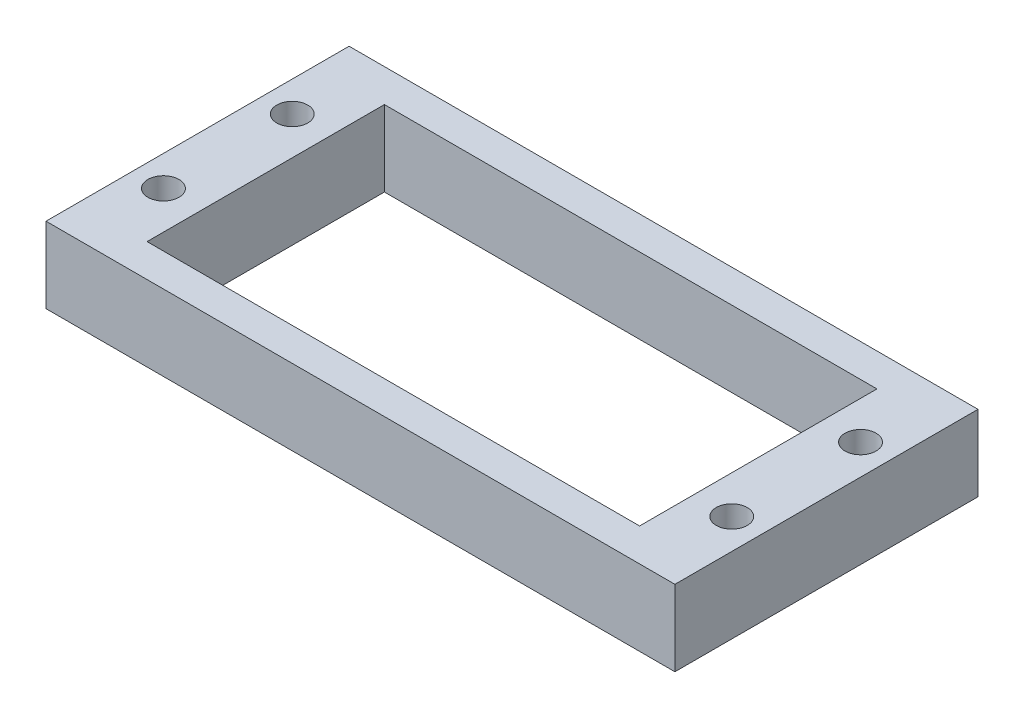
ISO-10303-21;
HEADER;
FILE_DESCRIPTION(('STEP AP214'),'2;1');
FILE_NAME('part.step','',(''),(''),'','','');
FILE_SCHEMA(('AUTOMOTIVE_DESIGN { 1 0 10303 214 1 1 1 1 }'));
ENDSEC;
DATA;
#1=APPLICATION_CONTEXT('core data for automotive mechanical design processes');
#2=APPLICATION_PROTOCOL_DEFINITION('international standard','automotive_design',2000,#1);
#3=PRODUCT_CONTEXT('',#1,'mechanical');
#4=PRODUCT('Part','Part','',(#3));
#5=PRODUCT_RELATED_PRODUCT_CATEGORY('part','',(#4));
#6=PRODUCT_DEFINITION_FORMATION('','',#4);
#7=PRODUCT_DEFINITION_CONTEXT('part definition',#1,'design');
#8=PRODUCT_DEFINITION('design','',#6,#7);
#9=PRODUCT_DEFINITION_SHAPE('','',#8);
#10=(LENGTH_UNIT() NAMED_UNIT(*) SI_UNIT(.MILLI.,.METRE.));
#11=(NAMED_UNIT(*) PLANE_ANGLE_UNIT() SI_UNIT($,.RADIAN.));
#12=(NAMED_UNIT(*) SI_UNIT($,.STERADIAN.) SOLID_ANGLE_UNIT());
#13=UNCERTAINTY_MEASURE_WITH_UNIT(LENGTH_MEASURE(1.E-05),#10,'distance_accuracy_value','');
#14=(GEOMETRIC_REPRESENTATION_CONTEXT(3) GLOBAL_UNCERTAINTY_ASSIGNED_CONTEXT((#13)) GLOBAL_UNIT_ASSIGNED_CONTEXT((#10,
#11,#12)) REPRESENTATION_CONTEXT('',''));
#15=CARTESIAN_POINT('',(0.,0.,0.));
#16=DIRECTION('',(0.,0.,1.));
#17=DIRECTION('',(1.,0.,0.));
#18=AXIS2_PLACEMENT_3D('',#15,#16,#17);
#19=CARTESIAN_POINT('',(41.5,10.,0.));
#20=DIRECTION('',(1.,0.,0.));
#21=DIRECTION('',(0.,0.,-1.));
#22=AXIS2_PLACEMENT_3D('',#19,#20,#21);
#23=PLANE('',#22);
#24=DIRECTION('',(0.,0.,1.));
#25=VECTOR('',#24,1.);
#26=CARTESIAN_POINT('',(41.5,0.,0.));
#27=LINE('',#26,#25);
#28=CARTESIAN_POINT('',(41.5,0.,-20.));
#29=VERTEX_POINT('',#28);
#30=CARTESIAN_POINT('',(41.5,0.,20.));
#31=VERTEX_POINT('',#30);
#32=EDGE_CURVE('E161',#29,#31,#27,.T.);
#33=ORIENTED_EDGE('',*,*,#32,.F.);
#34=DIRECTION('',(0.,-1.,0.));
#35=VECTOR('',#34,1.);
#36=CARTESIAN_POINT('',(41.5,10.,-20.));
#37=LINE('',#36,#35);
#38=CARTESIAN_POINT('',(41.5,10.,-20.));
#39=VERTEX_POINT('',#38);
#40=EDGE_CURVE('E11',#39,#29,#37,.T.);
#41=ORIENTED_EDGE('',*,*,#40,.F.);
#42=DIRECTION('',(0.,0.,1.));
#43=VECTOR('',#42,1.);
#44=CARTESIAN_POINT('',(41.5,10.,0.));
#45=LINE('',#44,#43);
#46=CARTESIAN_POINT('',(41.5,10.,20.));
#47=VERTEX_POINT('',#46);
#48=EDGE_CURVE('E129',#39,#47,#45,.T.);
#49=ORIENTED_EDGE('',*,*,#48,.T.);
#50=DIRECTION('',(0.,-1.,0.));
#51=VECTOR('',#50,1.);
#52=CARTESIAN_POINT('',(41.5,10.,20.));
#53=LINE('',#52,#51);
#54=EDGE_CURVE('E89',#47,#31,#53,.T.);
#55=ORIENTED_EDGE('',*,*,#54,.T.);
#56=EDGE_LOOP('',(#33,#41,#49,#55));
#57=FACE_BOUND('',#56,.T.);
#58=ADVANCED_FACE('F35',(#57),#23,.T.);
#59=CARTESIAN_POINT('',(0.,10.,-20.));
#60=DIRECTION('',(0.,0.,-1.));
#61=DIRECTION('',(-1.,0.,0.));
#62=AXIS2_PLACEMENT_3D('',#59,#60,#61);
#63=PLANE('',#62);
#64=DIRECTION('',(1.,0.,0.));
#65=VECTOR('',#64,1.);
#66=CARTESIAN_POINT('',(0.,0.,-20.));
#67=LINE('',#66,#65);
#68=CARTESIAN_POINT('',(-41.5,0.,-20.));
#69=VERTEX_POINT('',#68);
#70=EDGE_CURVE('E118',#69,#29,#67,.T.);
#71=ORIENTED_EDGE('',*,*,#70,.F.);
#72=DIRECTION('',(0.,-1.,0.));
#73=VECTOR('',#72,1.);
#74=CARTESIAN_POINT('',(-41.5,10.,-20.));
#75=LINE('',#74,#73);
#76=CARTESIAN_POINT('',(-41.5,10.,-20.));
#77=VERTEX_POINT('',#76);
#78=EDGE_CURVE('E45',#77,#69,#75,.T.);
#79=ORIENTED_EDGE('',*,*,#78,.F.);
#80=DIRECTION('',(1.,0.,0.));
#81=VECTOR('',#80,1.);
#82=CARTESIAN_POINT('',(0.,10.,-20.));
#83=LINE('',#82,#81);
#84=EDGE_CURVE('E116',#77,#39,#83,.T.);
#85=ORIENTED_EDGE('',*,*,#84,.T.);
#86=ORIENTED_EDGE('',*,*,#40,.T.);
#87=EDGE_LOOP('',(#71,#79,#85,#86));
#88=FACE_BOUND('',#87,.T.);
#89=ADVANCED_FACE('F114',(#88),#63,.T.);
#90=CARTESIAN_POINT('',(-41.5,10.,0.));
#91=DIRECTION('',(1.,0.,0.));
#92=DIRECTION('',(0.,0.,-1.));
#93=AXIS2_PLACEMENT_3D('',#90,#91,#92);
#94=PLANE('',#93);
#95=DIRECTION('',(0.,0.,1.));
#96=VECTOR('',#95,1.);
#97=CARTESIAN_POINT('',(-41.5,0.,0.));
#98=LINE('',#97,#96);
#99=CARTESIAN_POINT('',(-41.5,0.,20.));
#100=VERTEX_POINT('',#99);
#101=EDGE_CURVE('E164',#69,#100,#98,.T.);
#102=ORIENTED_EDGE('',*,*,#101,.T.);
#103=DIRECTION('',(0.,-1.,0.));
#104=VECTOR('',#103,1.);
#105=CARTESIAN_POINT('',(-41.5,10.,20.));
#106=LINE('',#105,#104);
#107=CARTESIAN_POINT('',(-41.5,10.,20.));
#108=VERTEX_POINT('',#107);
#109=EDGE_CURVE('E121',#108,#100,#106,.T.);
#110=ORIENTED_EDGE('',*,*,#109,.F.);
#111=DIRECTION('',(0.,0.,1.));
#112=VECTOR('',#111,1.);
#113=CARTESIAN_POINT('',(-41.5,10.,0.));
#114=LINE('',#113,#112);
#115=EDGE_CURVE('E124',#77,#108,#114,.T.);
#116=ORIENTED_EDGE('',*,*,#115,.F.);
#117=ORIENTED_EDGE('',*,*,#78,.T.);
#118=EDGE_LOOP('',(#102,#110,#116,#117));
#119=FACE_BOUND('',#118,.T.);
#120=ADVANCED_FACE('F125',(#119),#94,.F.);
#121=CARTESIAN_POINT('',(0.,10.,-15.6626506024096));
#122=DIRECTION('',(0.,0.,-1.));
#123=DIRECTION('',(-1.,0.,0.));
#124=AXIS2_PLACEMENT_3D('',#121,#122,#123);
#125=PLANE('',#124);
#126=DIRECTION('',(1.,0.,0.));
#127=VECTOR('',#126,1.);
#128=CARTESIAN_POINT('',(0.,0.,-15.6626506024096));
#129=LINE('',#128,#127);
#130=CARTESIAN_POINT('',(-32.5,0.,-15.6626506024096));
#131=VERTEX_POINT('',#130);
#132=CARTESIAN_POINT('',(32.5,0.,-15.6626506024096));
#133=VERTEX_POINT('',#132);
#134=EDGE_CURVE('E149',#131,#133,#129,.T.);
#135=ORIENTED_EDGE('',*,*,#134,.T.);
#136=DIRECTION('',(0.,-1.,0.));
#137=VECTOR('',#136,1.);
#138=CARTESIAN_POINT('',(32.5,10.,-15.6626506024096));
#139=LINE('',#138,#137);
#140=CARTESIAN_POINT('',(32.5,10.,-15.6626506024096));
#141=VERTEX_POINT('',#140);
#142=EDGE_CURVE('E39',#141,#133,#139,.T.);
#143=ORIENTED_EDGE('',*,*,#142,.F.);
#144=DIRECTION('',(1.,0.,0.));
#145=VECTOR('',#144,1.);
#146=CARTESIAN_POINT('',(0.,10.,-15.6626506024096));
#147=LINE('',#146,#145);
#148=CARTESIAN_POINT('',(-32.5,10.,-15.6626506024096));
#149=VERTEX_POINT('',#148);
#150=EDGE_CURVE('E314',#149,#141,#147,.T.);
#151=ORIENTED_EDGE('',*,*,#150,.F.);
#152=DIRECTION('',(0.,-1.,0.));
#153=VECTOR('',#152,1.);
#154=CARTESIAN_POINT('',(-32.5,10.,-15.6626506024096));
#155=LINE('',#154,#153);
#156=EDGE_CURVE('E142',#149,#131,#155,.T.);
#157=ORIENTED_EDGE('',*,*,#156,.T.);
#158=EDGE_LOOP('',(#135,#143,#151,#157));
#159=FACE_BOUND('',#158,.T.);
#160=ADVANCED_FACE('F187',(#159),#125,.F.);
#161=CARTESIAN_POINT('',(32.5,10.,0.));
#162=DIRECTION('',(1.,0.,0.));
#163=DIRECTION('',(0.,0.,-1.));
#164=AXIS2_PLACEMENT_3D('',#161,#162,#163);
#165=PLANE('',#164);
#166=DIRECTION('',(0.,0.,1.));
#167=VECTOR('',#166,1.);
#168=CARTESIAN_POINT('',(32.5,0.,0.));
#169=LINE('',#168,#167);
#170=CARTESIAN_POINT('',(32.5,0.,15.6626506024096));
#171=VERTEX_POINT('',#170);
#172=EDGE_CURVE('E152',#133,#171,#169,.T.);
#173=ORIENTED_EDGE('',*,*,#172,.T.);
#174=DIRECTION('',(0.,-1.,0.));
#175=VECTOR('',#174,1.);
#176=CARTESIAN_POINT('',(32.5,10.,15.6626506024096));
#177=LINE('',#176,#175);
#178=CARTESIAN_POINT('',(32.5,10.,15.6626506024096));
#179=VERTEX_POINT('',#178);
#180=EDGE_CURVE('E178',#179,#171,#177,.T.);
#181=ORIENTED_EDGE('',*,*,#180,.F.);
#182=DIRECTION('',(0.,0.,1.));
#183=VECTOR('',#182,1.);
#184=CARTESIAN_POINT('',(32.5,10.,0.));
#185=LINE('',#184,#183);
#186=EDGE_CURVE('E97',#141,#179,#185,.T.);
#187=ORIENTED_EDGE('',*,*,#186,.F.);
#188=ORIENTED_EDGE('',*,*,#142,.T.);
#189=EDGE_LOOP('',(#173,#181,#187,#188));
#190=FACE_BOUND('',#189,.T.);
#191=ADVANCED_FACE('F183',(#190),#165,.F.);
#192=CARTESIAN_POINT('',(0.,10.,15.6626506024096));
#193=DIRECTION('',(0.,0.,-1.));
#194=DIRECTION('',(-1.,0.,0.));
#195=AXIS2_PLACEMENT_3D('',#192,#193,#194);
#196=PLANE('',#195);
#197=DIRECTION('',(1.,0.,0.));
#198=VECTOR('',#197,1.);
#199=CARTESIAN_POINT('',(0.,0.,15.6626506024096));
#200=LINE('',#199,#198);
#201=CARTESIAN_POINT('',(-32.5,0.,15.6626506024096));
#202=VERTEX_POINT('',#201);
#203=EDGE_CURVE('E155',#202,#171,#200,.T.);
#204=ORIENTED_EDGE('',*,*,#203,.F.);
#205=DIRECTION('',(0.,-1.,0.));
#206=VECTOR('',#205,1.);
#207=CARTESIAN_POINT('',(-32.5,10.,15.6626506024096));
#208=LINE('',#207,#206);
#209=CARTESIAN_POINT('',(-32.5,10.,15.6626506024096));
#210=VERTEX_POINT('',#209);
#211=EDGE_CURVE('E177',#210,#202,#208,.T.);
#212=ORIENTED_EDGE('',*,*,#211,.F.);
#213=DIRECTION('',(1.,0.,0.));
#214=VECTOR('',#213,1.);
#215=CARTESIAN_POINT('',(0.,10.,15.6626506024096));
#216=LINE('',#215,#214);
#217=EDGE_CURVE('E316',#210,#179,#216,.T.);
#218=ORIENTED_EDGE('',*,*,#217,.T.);
#219=ORIENTED_EDGE('',*,*,#180,.T.);
#220=EDGE_LOOP('',(#204,#212,#218,#219));
#221=FACE_BOUND('',#220,.T.);
#222=ADVANCED_FACE('F196',(#221),#196,.T.);
#223=CARTESIAN_POINT('',(37.5,10.,8.49999999999999));
#224=DIRECTION('',(0.,-1.,0.));
#225=DIRECTION('',(0.,0.,-1.));
#226=AXIS2_PLACEMENT_3D('',#223,#224,#225);
#227=CYLINDRICAL_SURFACE('',#226,2.05);
#228=CARTESIAN_POINT('',(37.5,10.,8.49999999999999));
#229=DIRECTION('',(0.,1.,0.));
#230=DIRECTION('',(0.,0.,1.));
#231=AXIS2_PLACEMENT_3D('',#228,#229,#230);
#232=CIRCLE('',#231,2.05);
#233=CARTESIAN_POINT('',(37.5,10.,10.55));
#234=VERTEX_POINT('',#233);
#235=EDGE_CURVE('E136',#234,#234,#232,.T.);
#236=ORIENTED_EDGE('',*,*,#235,.T.);
#237=EDGE_LOOP('',(#236));
#238=FACE_BOUND('',#237,.T.);
#239=CARTESIAN_POINT('',(37.5,0.,8.49999999999999));
#240=DIRECTION('',(0.,1.,0.));
#241=DIRECTION('',(0.,0.,1.));
#242=AXIS2_PLACEMENT_3D('',#239,#240,#241);
#243=CIRCLE('',#242,2.05);
#244=CARTESIAN_POINT('',(37.5,0.,10.55));
#245=VERTEX_POINT('',#244);
#246=EDGE_CURVE('E167',#245,#245,#243,.T.);
#247=ORIENTED_EDGE('',*,*,#246,.F.);
#248=EDGE_LOOP('',(#247));
#249=FACE_BOUND('',#248,.T.);
#250=ADVANCED_FACE('F198',(#238,#249),#227,.F.);
#251=CARTESIAN_POINT('',(0.,10.,20.));
#252=DIRECTION('',(0.,0.,-1.));
#253=DIRECTION('',(-1.,0.,0.));
#254=AXIS2_PLACEMENT_3D('',#251,#252,#253);
#255=PLANE('',#254);
#256=DIRECTION('',(1.,0.,0.));
#257=VECTOR('',#256,1.);
#258=CARTESIAN_POINT('',(0.,0.,20.));
#259=LINE('',#258,#257);
#260=EDGE_CURVE('E82',#100,#31,#259,.T.);
#261=ORIENTED_EDGE('',*,*,#260,.T.);
#262=ORIENTED_EDGE('',*,*,#54,.F.);
#263=DIRECTION('',(1.,0.,0.));
#264=VECTOR('',#263,1.);
#265=CARTESIAN_POINT('',(0.,10.,20.));
#266=LINE('',#265,#264);
#267=EDGE_CURVE('E54',#108,#47,#266,.T.);
#268=ORIENTED_EDGE('',*,*,#267,.F.);
#269=ORIENTED_EDGE('',*,*,#109,.T.);
#270=EDGE_LOOP('',(#261,#262,#268,#269));
#271=FACE_BOUND('',#270,.T.);
#272=ADVANCED_FACE('F204',(#271),#255,.F.);
#273=CARTESIAN_POINT('',(-32.5,10.,0.));
#274=DIRECTION('',(1.,0.,0.));
#275=DIRECTION('',(0.,0.,-1.));
#276=AXIS2_PLACEMENT_3D('',#273,#274,#275);
#277=PLANE('',#276);
#278=DIRECTION('',(0.,0.,1.));
#279=VECTOR('',#278,1.);
#280=CARTESIAN_POINT('',(-32.5,0.,0.));
#281=LINE('',#280,#279);
#282=EDGE_CURVE('E158',#131,#202,#281,.T.);
#283=ORIENTED_EDGE('',*,*,#282,.F.);
#284=ORIENTED_EDGE('',*,*,#156,.F.);
#285=DIRECTION('',(0.,0.,1.));
#286=VECTOR('',#285,1.);
#287=CARTESIAN_POINT('',(-32.5,10.,0.));
#288=LINE('',#287,#286);
#289=EDGE_CURVE('E131',#149,#210,#288,.T.);
#290=ORIENTED_EDGE('',*,*,#289,.T.);
#291=ORIENTED_EDGE('',*,*,#211,.T.);
#292=EDGE_LOOP('',(#283,#284,#290,#291));
#293=FACE_BOUND('',#292,.T.);
#294=ADVANCED_FACE('F192',(#293),#277,.T.);
#295=CARTESIAN_POINT('',(-37.5,10.,-8.5));
#296=DIRECTION('',(0.,-1.,0.));
#297=DIRECTION('',(0.,0.,-1.));
#298=AXIS2_PLACEMENT_3D('',#295,#296,#297);
#299=CYLINDRICAL_SURFACE('',#298,2.05);
#300=CARTESIAN_POINT('',(-37.5,10.,-8.5));
#301=DIRECTION('',(0.,1.,0.));
#302=DIRECTION('',(0.,0.,1.));
#303=AXIS2_PLACEMENT_3D('',#300,#301,#302);
#304=CIRCLE('',#303,2.05);
#305=CARTESIAN_POINT('',(-37.5,10.,-6.45));
#306=VERTEX_POINT('',#305);
#307=EDGE_CURVE('E313',#306,#306,#304,.T.);
#308=ORIENTED_EDGE('',*,*,#307,.T.);
#309=EDGE_LOOP('',(#308));
#310=FACE_BOUND('',#309,.T.);
#311=CARTESIAN_POINT('',(-37.5,0.,-8.5));
#312=DIRECTION('',(0.,1.,0.));
#313=DIRECTION('',(0.,0.,1.));
#314=AXIS2_PLACEMENT_3D('',#311,#312,#313);
#315=CIRCLE('',#314,2.05);
#316=CARTESIAN_POINT('',(-37.5,0.,-6.45));
#317=VERTEX_POINT('',#316);
#318=EDGE_CURVE('E146',#317,#317,#315,.T.);
#319=ORIENTED_EDGE('',*,*,#318,.F.);
#320=EDGE_LOOP('',(#319));
#321=FACE_BOUND('',#320,.T.);
#322=ADVANCED_FACE('F217',(#310,#321),#299,.F.);
#323=CARTESIAN_POINT('',(-37.5,10.,8.5));
#324=DIRECTION('',(0.,-1.,0.));
#325=DIRECTION('',(0.,0.,-1.));
#326=AXIS2_PLACEMENT_3D('',#323,#324,#325);
#327=CYLINDRICAL_SURFACE('',#326,2.05);
#328=CARTESIAN_POINT('',(-37.5,10.,8.5));
#329=DIRECTION('',(0.,1.,0.));
#330=DIRECTION('',(0.,0.,1.));
#331=AXIS2_PLACEMENT_3D('',#328,#329,#330);
#332=CIRCLE('',#331,2.05);
#333=CARTESIAN_POINT('',(-37.5,10.,10.55));
#334=VERTEX_POINT('',#333);
#335=EDGE_CURVE('E173',#334,#334,#332,.F.);
#336=ORIENTED_EDGE('',*,*,#335,.F.);
#337=EDGE_LOOP('',(#336));
#338=FACE_BOUND('',#337,.T.);
#339=CARTESIAN_POINT('',(-37.5,0.,8.5));
#340=DIRECTION('',(0.,1.,0.));
#341=DIRECTION('',(0.,0.,1.));
#342=AXIS2_PLACEMENT_3D('',#339,#340,#341);
#343=CIRCLE('',#342,2.05);
#344=CARTESIAN_POINT('',(-37.5,0.,10.55));
#345=VERTEX_POINT('',#344);
#346=EDGE_CURVE('E143',#345,#345,#343,.F.);
#347=ORIENTED_EDGE('',*,*,#346,.T.);
#348=EDGE_LOOP('',(#347));
#349=FACE_BOUND('',#348,.T.);
#350=ADVANCED_FACE('F37',(#338,#349),#327,.F.);
#351=CARTESIAN_POINT('',(37.5,10.,-8.50000000000001));
#352=DIRECTION('',(0.,-1.,0.));
#353=DIRECTION('',(0.,0.,-1.));
#354=AXIS2_PLACEMENT_3D('',#351,#352,#353);
#355=CYLINDRICAL_SURFACE('',#354,2.05);
#356=CARTESIAN_POINT('',(37.5,10.,-8.50000000000001));
#357=DIRECTION('',(0.,1.,0.));
#358=DIRECTION('',(0.,0.,1.));
#359=AXIS2_PLACEMENT_3D('',#356,#357,#358);
#360=CIRCLE('',#359,2.05);
#361=CARTESIAN_POINT('',(37.5,10.,-6.45000000000001));
#362=VERTEX_POINT('',#361);
#363=EDGE_CURVE('E139',#362,#362,#360,.F.);
#364=ORIENTED_EDGE('',*,*,#363,.F.);
#365=EDGE_LOOP('',(#364));
#366=FACE_BOUND('',#365,.T.);
#367=CARTESIAN_POINT('',(37.5,0.,-8.50000000000001));
#368=DIRECTION('',(0.,1.,0.));
#369=DIRECTION('',(0.,0.,1.));
#370=AXIS2_PLACEMENT_3D('',#367,#368,#369);
#371=CIRCLE('',#370,2.05);
#372=CARTESIAN_POINT('',(37.5,0.,-6.45000000000001));
#373=VERTEX_POINT('',#372);
#374=EDGE_CURVE('E170',#373,#373,#371,.F.);
#375=ORIENTED_EDGE('',*,*,#374,.T.);
#376=EDGE_LOOP('',(#375));
#377=FACE_BOUND('',#376,.T.);
#378=ADVANCED_FACE('F272',(#366,#377),#355,.F.);
#379=CARTESIAN_POINT('',(0.,10.,0.));
#380=DIRECTION('',(0.,1.,0.));
#381=DIRECTION('',(0.,0.,1.));
#382=AXIS2_PLACEMENT_3D('',#379,#380,#381);
#383=PLANE('',#382);
#384=ORIENTED_EDGE('',*,*,#335,.T.);
#385=EDGE_LOOP('',(#384));
#386=FACE_BOUND('',#385,.T.);
#387=ORIENTED_EDGE('',*,*,#307,.F.);
#388=EDGE_LOOP('',(#387));
#389=FACE_BOUND('',#388,.T.);
#390=ORIENTED_EDGE('',*,*,#150,.T.);
#391=ORIENTED_EDGE('',*,*,#186,.T.);
#392=ORIENTED_EDGE('',*,*,#217,.F.);
#393=ORIENTED_EDGE('',*,*,#289,.F.);
#394=EDGE_LOOP('',(#390,#391,#392,#393));
#395=FACE_BOUND('',#394,.T.);
#396=ORIENTED_EDGE('',*,*,#48,.F.);
#397=ORIENTED_EDGE('',*,*,#84,.F.);
#398=ORIENTED_EDGE('',*,*,#115,.T.);
#399=ORIENTED_EDGE('',*,*,#267,.T.);
#400=EDGE_LOOP('',(#396,#397,#398,#399));
#401=FACE_BOUND('',#400,.T.);
#402=ORIENTED_EDGE('',*,*,#235,.F.);
#403=EDGE_LOOP('',(#402));
#404=FACE_BOUND('',#403,.T.);
#405=ORIENTED_EDGE('',*,*,#363,.T.);
#406=EDGE_LOOP('',(#405));
#407=FACE_BOUND('',#406,.T.);
#408=ADVANCED_FACE('F127',(#386,#389,#395,#401,#404,#407),#383,.T.);
#409=CARTESIAN_POINT('',(0.,0.,0.));
#410=DIRECTION('',(0.,1.,0.));
#411=DIRECTION('',(0.,0.,1.));
#412=AXIS2_PLACEMENT_3D('',#409,#410,#411);
#413=PLANE('',#412);
#414=ORIENTED_EDGE('',*,*,#346,.F.);
#415=EDGE_LOOP('',(#414));
#416=FACE_BOUND('',#415,.T.);
#417=ORIENTED_EDGE('',*,*,#318,.T.);
#418=EDGE_LOOP('',(#417));
#419=FACE_BOUND('',#418,.T.);
#420=ORIENTED_EDGE('',*,*,#134,.F.);
#421=ORIENTED_EDGE('',*,*,#282,.T.);
#422=ORIENTED_EDGE('',*,*,#203,.T.);
#423=ORIENTED_EDGE('',*,*,#172,.F.);
#424=EDGE_LOOP('',(#420,#421,#422,#423));
#425=FACE_BOUND('',#424,.T.);
#426=ORIENTED_EDGE('',*,*,#32,.T.);
#427=ORIENTED_EDGE('',*,*,#260,.F.);
#428=ORIENTED_EDGE('',*,*,#101,.F.);
#429=ORIENTED_EDGE('',*,*,#70,.T.);
#430=EDGE_LOOP('',(#426,#427,#428,#429));
#431=FACE_BOUND('',#430,.T.);
#432=ORIENTED_EDGE('',*,*,#246,.T.);
#433=EDGE_LOOP('',(#432));
#434=FACE_BOUND('',#433,.T.);
#435=ORIENTED_EDGE('',*,*,#374,.F.);
#436=EDGE_LOOP('',(#435));
#437=FACE_BOUND('',#436,.T.);
#438=ADVANCED_FACE('F190',(#416,#419,#425,#431,#434,#437),#413,.F.);
#439=CLOSED_SHELL('',(#58,#89,#120,#160,#191,#222,#250,#272,#294,#322,#350,#378,#408,#438));
#440=MANIFOLD_SOLID_BREP('B2',#439);
#441=ADVANCED_BREP_SHAPE_REPRESENTATION('',(#18,#440),#14);
#442=SHAPE_DEFINITION_REPRESENTATION(#9,#441);
ENDSEC;
END-ISO-10303-21;
